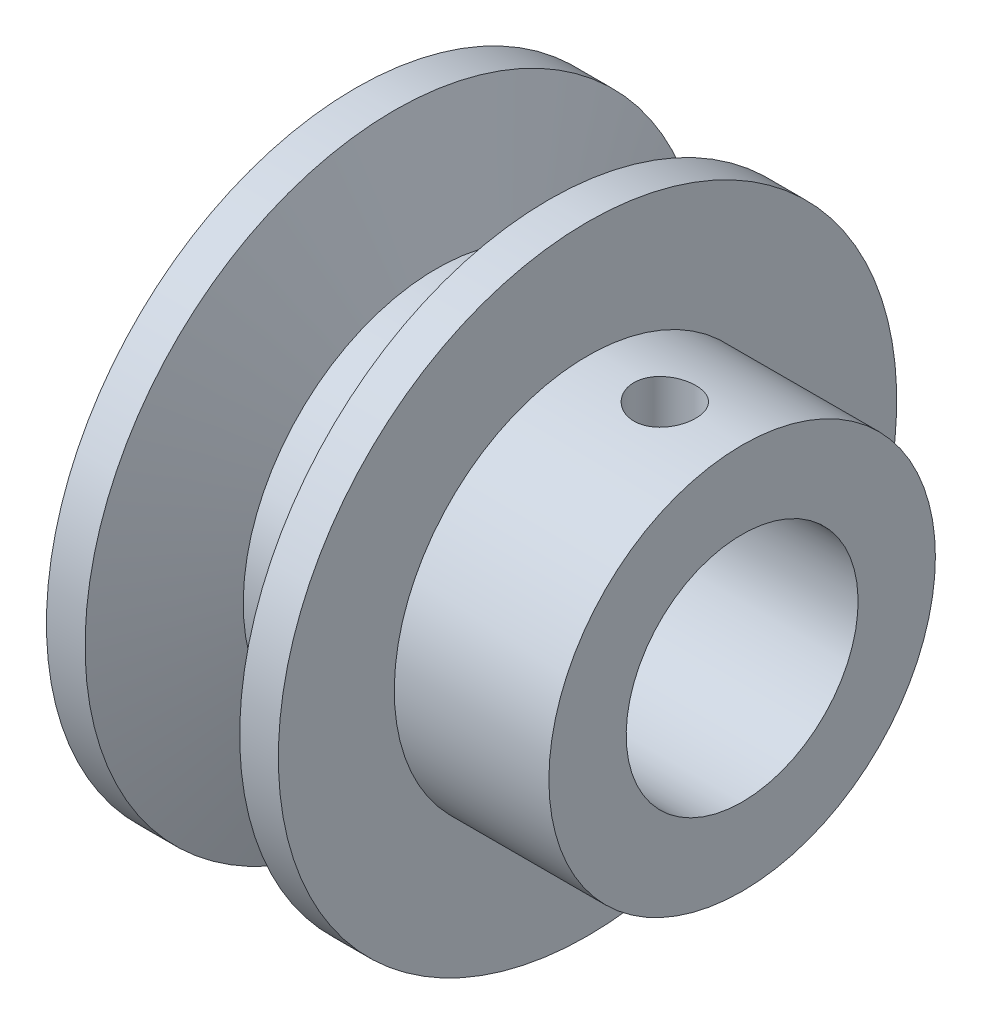
ISO-10303-21;
HEADER;
FILE_DESCRIPTION(('STEP AP214'),'2;1');
FILE_NAME('part.step','',(''),(''),'','','');
FILE_SCHEMA(('AUTOMOTIVE_DESIGN { 1 0 10303 214 1 1 1 1 }'));
ENDSEC;
DATA;
#1=APPLICATION_CONTEXT('core data for automotive mechanical design processes');
#2=APPLICATION_PROTOCOL_DEFINITION('international standard','automotive_design',2000,#1);
#3=PRODUCT_CONTEXT('',#1,'mechanical');
#4=PRODUCT('Part','Part','',(#3));
#5=PRODUCT_RELATED_PRODUCT_CATEGORY('part','',(#4));
#6=PRODUCT_DEFINITION_FORMATION('','',#4);
#7=PRODUCT_DEFINITION_CONTEXT('part definition',#1,'design');
#8=PRODUCT_DEFINITION('design','',#6,#7);
#9=PRODUCT_DEFINITION_SHAPE('','',#8);
#10=(LENGTH_UNIT() NAMED_UNIT(*) SI_UNIT(.MILLI.,.METRE.));
#11=(NAMED_UNIT(*) PLANE_ANGLE_UNIT() SI_UNIT($,.RADIAN.));
#12=(NAMED_UNIT(*) SI_UNIT($,.STERADIAN.) SOLID_ANGLE_UNIT());
#13=UNCERTAINTY_MEASURE_WITH_UNIT(LENGTH_MEASURE(1.E-05),#10,'distance_accuracy_value','');
#14=(GEOMETRIC_REPRESENTATION_CONTEXT(3) GLOBAL_UNCERTAINTY_ASSIGNED_CONTEXT((#13)) GLOBAL_UNIT_ASSIGNED_CONTEXT((#10,
#11,#12)) REPRESENTATION_CONTEXT('',''));
#15=CARTESIAN_POINT('',(0.,0.,0.));
#16=DIRECTION('',(0.,0.,1.));
#17=DIRECTION('',(1.,0.,0.));
#18=AXIS2_PLACEMENT_3D('',#15,#16,#17);
#19=CARTESIAN_POINT('',(0.,0.,0.));
#20=DIRECTION('',(1.,0.,0.));
#21=DIRECTION('',(0.,1.,0.));
#22=AXIS2_PLACEMENT_3D('',#19,#20,#21);
#23=PLANE('',#22);
#24=CARTESIAN_POINT('',(0.,0.,0.));
#25=DIRECTION('',(-1.,0.,0.));
#26=DIRECTION('',(0.,-1.,0.));
#27=AXIS2_PLACEMENT_3D('',#24,#25,#26);
#28=CIRCLE('',#27,20.);
#29=CARTESIAN_POINT('',(0.,-20.,0.));
#30=VERTEX_POINT('',#29);
#31=EDGE_CURVE('E67',#30,#30,#28,.T.);
#32=ORIENTED_EDGE('',*,*,#31,.F.);
#33=EDGE_LOOP('',(#32));
#34=FACE_BOUND('',#33,.T.);
#35=CARTESIAN_POINT('',(0.,0.,0.));
#36=DIRECTION('',(-1.,0.,0.));
#37=DIRECTION('',(0.,-1.,0.));
#38=AXIS2_PLACEMENT_3D('',#35,#36,#37);
#39=CIRCLE('',#38,40.);
#40=CARTESIAN_POINT('',(0.,-40.,0.));
#41=VERTEX_POINT('',#40);
#42=EDGE_CURVE('E42',#41,#41,#39,.T.);
#43=ORIENTED_EDGE('',*,*,#42,.T.);
#44=EDGE_LOOP('',(#43));
#45=FACE_BOUND('',#44,.T.);
#46=ADVANCED_FACE('F36',(#34,#45),#23,.F.);
#47=CARTESIAN_POINT('',(0.,0.,0.));
#48=DIRECTION('',(-1.,0.,0.));
#49=DIRECTION('',(0.,-1.,0.));
#50=AXIS2_PLACEMENT_3D('',#47,#48,#49);
#51=CYLINDRICAL_SURFACE('',#50,40.);
#52=ORIENTED_EDGE('',*,*,#42,.F.);
#53=EDGE_LOOP('',(#52));
#54=FACE_BOUND('',#53,.T.);
#55=CARTESIAN_POINT('',(5.,0.,0.));
#56=DIRECTION('',(-1.,0.,0.));
#57=DIRECTION('',(0.,-1.,0.));
#58=AXIS2_PLACEMENT_3D('',#55,#56,#57);
#59=CIRCLE('',#58,40.);
#60=CARTESIAN_POINT('',(4.99999999999999,-40.,0.));
#61=VERTEX_POINT('',#60);
#62=EDGE_CURVE('E46',#61,#61,#59,.T.);
#63=ORIENTED_EDGE('',*,*,#62,.T.);
#64=EDGE_LOOP('',(#63));
#65=FACE_BOUND('',#64,.T.);
#66=ADVANCED_FACE('F127',(#54,#65),#51,.T.);
#67=CARTESIAN_POINT('',(10.459553513993,0.,0.));
#68=DIRECTION('',(-1.,0.,0.));
#69=DIRECTION('',(0.,-1.,0.));
#70=AXIS2_PLACEMENT_3D('',#67,#68,#69);
#71=CONICAL_SURFACE('',#70,25.,1.22173047639603);
#72=ORIENTED_EDGE('',*,*,#62,.F.);
#73=EDGE_LOOP('',(#72));
#74=FACE_BOUND('',#73,.T.);
#75=CARTESIAN_POINT('',(10.459553513993,0.,0.));
#76=DIRECTION('',(-1.,0.,0.));
#77=DIRECTION('',(0.,-1.,0.));
#78=AXIS2_PLACEMENT_3D('',#75,#76,#77);
#79=CIRCLE('',#78,25.);
#80=CARTESIAN_POINT('',(10.459553513993,-25.,0.));
#81=VERTEX_POINT('',#80);
#82=EDGE_CURVE('E50',#81,#81,#79,.T.);
#83=ORIENTED_EDGE('',*,*,#82,.T.);
#84=EDGE_LOOP('',(#83));
#85=FACE_BOUND('',#84,.T.);
#86=ADVANCED_FACE('F124',(#74,#85),#71,.T.);
#87=CARTESIAN_POINT('',(0.,0.,0.));
#88=DIRECTION('',(-1.,0.,0.));
#89=DIRECTION('',(0.,-1.,0.));
#90=AXIS2_PLACEMENT_3D('',#87,#88,#89);
#91=CYLINDRICAL_SURFACE('',#90,25.);
#92=ORIENTED_EDGE('',*,*,#82,.F.);
#93=EDGE_LOOP('',(#92));
#94=FACE_BOUND('',#93,.T.);
#95=CARTESIAN_POINT('',(19.5404464860069,0.,0.));
#96=DIRECTION('',(-1.,0.,0.));
#97=DIRECTION('',(0.,-1.,0.));
#98=AXIS2_PLACEMENT_3D('',#95,#96,#97);
#99=CIRCLE('',#98,25.);
#100=CARTESIAN_POINT('',(19.5404464860069,-25.,0.));
#101=VERTEX_POINT('',#100);
#102=EDGE_CURVE('E55',#101,#101,#99,.T.);
#103=ORIENTED_EDGE('',*,*,#102,.T.);
#104=EDGE_LOOP('',(#103));
#105=FACE_BOUND('',#104,.T.);
#106=ADVANCED_FACE('F120',(#94,#105),#91,.T.);
#107=CARTESIAN_POINT('',(25.,0.,0.));
#108=DIRECTION('',(1.,0.,0.));
#109=DIRECTION('',(0.,1.,0.));
#110=AXIS2_PLACEMENT_3D('',#107,#108,#109);
#111=CONICAL_SURFACE('',#110,40.,1.22173047639603);
#112=ORIENTED_EDGE('',*,*,#102,.F.);
#113=EDGE_LOOP('',(#112));
#114=FACE_BOUND('',#113,.T.);
#115=CARTESIAN_POINT('',(25.,0.,0.));
#116=DIRECTION('',(-1.,0.,0.));
#117=DIRECTION('',(0.,-1.,0.));
#118=AXIS2_PLACEMENT_3D('',#115,#116,#117);
#119=CIRCLE('',#118,40.);
#120=CARTESIAN_POINT('',(25.,-40.,0.));
#121=VERTEX_POINT('',#120);
#122=EDGE_CURVE('E58',#121,#121,#119,.T.);
#123=ORIENTED_EDGE('',*,*,#122,.T.);
#124=EDGE_LOOP('',(#123));
#125=FACE_BOUND('',#124,.T.);
#126=ADVANCED_FACE('F116',(#114,#125),#111,.T.);
#127=CARTESIAN_POINT('',(0.,0.,0.));
#128=DIRECTION('',(-1.,0.,0.));
#129=DIRECTION('',(0.,-1.,0.));
#130=AXIS2_PLACEMENT_3D('',#127,#128,#129);
#131=CYLINDRICAL_SURFACE('',#130,40.);
#132=ORIENTED_EDGE('',*,*,#122,.F.);
#133=EDGE_LOOP('',(#132));
#134=FACE_BOUND('',#133,.T.);
#135=CARTESIAN_POINT('',(30.,0.,0.));
#136=DIRECTION('',(-1.,0.,0.));
#137=DIRECTION('',(0.,-1.,0.));
#138=AXIS2_PLACEMENT_3D('',#135,#136,#137);
#139=CIRCLE('',#138,40.);
#140=CARTESIAN_POINT('',(30.,-40.,0.));
#141=VERTEX_POINT('',#140);
#142=EDGE_CURVE('E61',#141,#141,#139,.T.);
#143=ORIENTED_EDGE('',*,*,#142,.T.);
#144=EDGE_LOOP('',(#143));
#145=FACE_BOUND('',#144,.T.);
#146=ADVANCED_FACE('F112',(#134,#145),#131,.T.);
#147=CARTESIAN_POINT('',(30.,40.,0.));
#148=DIRECTION('',(-1.,0.,0.));
#149=DIRECTION('',(0.,-1.,0.));
#150=AXIS2_PLACEMENT_3D('',#147,#148,#149);
#151=PLANE('',#150);
#152=CARTESIAN_POINT('',(30.,0.,0.));
#153=DIRECTION('',(-1.,0.,0.));
#154=DIRECTION('',(0.,-1.,0.));
#155=AXIS2_PLACEMENT_3D('',#152,#153,#154);
#156=CIRCLE('',#155,25.);
#157=CARTESIAN_POINT('',(30.,-25.,0.));
#158=VERTEX_POINT('',#157);
#159=EDGE_CURVE('E10',#158,#158,#156,.F.);
#160=ORIENTED_EDGE('',*,*,#159,.F.);
#161=EDGE_LOOP('',(#160));
#162=FACE_BOUND('',#161,.T.);
#163=ORIENTED_EDGE('',*,*,#142,.F.);
#164=EDGE_LOOP('',(#163));
#165=FACE_BOUND('',#164,.T.);
#166=ADVANCED_FACE('F108',(#162,#165),#151,.F.);
#167=CARTESIAN_POINT('',(50.,0.,0.));
#168=DIRECTION('',(-1.,0.,0.));
#169=DIRECTION('',(0.,-1.,0.));
#170=AXIS2_PLACEMENT_3D('',#167,#168,#169);
#171=CYLINDRICAL_SURFACE('',#170,25.);
#172=CARTESIAN_POINT('',(40.,24.6779253585061,4.00000000000001));
#173=CARTESIAN_POINT('',(40.2231334307392,24.6779292731494,3.99999092536539));
#174=CARTESIAN_POINT('',(40.4463918817528,24.6809844341802,3.98126611040704));
#175=CARTESIAN_POINT('',(40.8866536946893,24.6928650235043,3.9068889100177));
#176=CARTESIAN_POINT('',(41.1036509490092,24.7016958995272,3.85120166039988));
#177=CARTESIAN_POINT('',(41.5249546262025,24.7241027007214,3.70461945874254));
#178=CARTESIAN_POINT('',(41.7292711432905,24.7376747931883,3.6137529385178));
#179=CARTESIAN_POINT('',(42.1197329607769,24.7680302580012,3.39946083296861));
#180=CARTESIAN_POINT('',(42.3058804898718,24.784813235735,3.27603924790085));
#181=CARTESIAN_POINT('',(42.6564378655906,24.819870017184,2.99894280472959));
#182=CARTESIAN_POINT('',(42.8206585310196,24.8381548393908,2.84502997415169));
#183=CARTESIAN_POINT('',(43.1210589193203,24.8740570032156,2.51183419630463));
#184=CARTESIAN_POINT('',(43.2572370306015,24.8916743064242,2.33254979194337));
#185=CARTESIAN_POINT('',(43.4983919225834,24.9243725216135,1.95247983405863));
#186=CARTESIAN_POINT('',(43.6031933806762,24.9394389842577,1.75158168894769));
#187=CARTESIAN_POINT('',(43.77749387812,24.9652155524521,1.33475199178192));
#188=CARTESIAN_POINT('',(43.8469950349814,24.9759259192977,1.11882134234493));
#189=CARTESIAN_POINT('',(43.9481454887249,24.9917057633414,0.680008257892135));
#190=CARTESIAN_POINT('',(43.9801122388102,24.9968225235199,0.457200726718813));
#191=CARTESIAN_POINT('',(44.0062730161714,25.001000923532,0.00932961504450166));
#192=CARTESIAN_POINT('',(44.0004694182899,25.0000629440624,-0.215733822726023));
#193=CARTESIAN_POINT('',(43.95150302863,24.9922751229404,-0.659559431957065));
#194=CARTESIAN_POINT('',(43.9086818315054,24.9854793381704,-0.878360374642832));
#195=CARTESIAN_POINT('',(43.7874329707507,24.9667997195147,-1.30563068549535));
#196=CARTESIAN_POINT('',(43.7090042903812,24.9549157403409,-1.51409975845637));
#197=CARTESIAN_POINT('',(43.5184230825998,24.9273026006901,-1.91581197281808));
#198=CARTESIAN_POINT('',(43.4061285452084,24.9115573014927,-2.10898658698768));
#199=CARTESIAN_POINT('',(43.151107142766,24.8779731229889,-2.47387934314066));
#200=CARTESIAN_POINT('',(43.0083780036584,24.8601340872846,-2.64559588026693));
#201=CARTESIAN_POINT('',(42.6946408728795,24.8241131404317,-2.96471443147072));
#202=CARTESIAN_POINT('',(42.5233344483182,24.8059296259375,-3.111823016432));
#203=CARTESIAN_POINT('',(42.1583144874561,24.7714627701456,-3.37525361654882));
#204=CARTESIAN_POINT('',(41.9646007746212,24.7551794438203,-3.49157538912893));
#205=CARTESIAN_POINT('',(41.559938980086,24.7263563099702,-3.69018063254586));
#206=CARTESIAN_POINT('',(41.3489743296873,24.7138201565097,-3.77243090843838));
#207=CARTESIAN_POINT('',(40.9159787567133,24.6939728783789,-3.9002470802389));
#208=CARTESIAN_POINT('',(40.6939487292713,24.6866613317959,-3.94581593839022));
#209=CARTESIAN_POINT('',(40.2477443546531,24.6781720983454,-3.99856699995258));
#210=CARTESIAN_POINT('',(40.0236205706312,24.676927730288,-4.00616652749842));
#211=CARTESIAN_POINT('',(39.5773020674687,24.6805363746112,-3.98387335096491));
#212=CARTESIAN_POINT('',(39.355107280175,24.6853891706843,-3.95398197694093));
#213=CARTESIAN_POINT('',(38.9202661891112,24.7005838939959,-3.85791055409722));
#214=CARTESIAN_POINT('',(38.7075721536385,24.7108939600193,-3.79194106688482));
#215=CARTESIAN_POINT('',(38.2962592259666,24.7358149947642,-3.62580613822712));
#216=CARTESIAN_POINT('',(38.0976411166363,24.7504262024721,-3.5256387965801));
#217=CARTESIAN_POINT('',(37.7182552138371,24.7824590360601,-3.29295930434825));
#218=CARTESIAN_POINT('',(37.5376540928599,24.7999035665773,-3.16017860187711));
#219=CARTESIAN_POINT('',(37.2011478787265,24.8355696830306,-2.8664120849539));
#220=CARTESIAN_POINT('',(37.0452443827199,24.8537913191241,-2.70542444782833));
#221=CARTESIAN_POINT('',(36.7610454158143,24.8891684164148,-2.35796950976243));
#222=CARTESIAN_POINT('',(36.6330275417784,24.9063120466622,-2.17127376458599));
#223=CARTESIAN_POINT('',(36.410173908023,24.9374141993437,-1.77878369477712));
#224=CARTESIAN_POINT('',(36.3153371413544,24.951372818429,-1.57298994995265));
#225=CARTESIAN_POINT('',(36.1619745519626,24.9744805999486,-1.14898755418868));
#226=CARTESIAN_POINT('',(36.103300787528,24.9836493338541,-0.930833526197157));
#227=CARTESIAN_POINT('',(36.023452327215,24.9962267816708,-0.487610510439652));
#228=CARTESIAN_POINT('',(36.0022747976919,24.9996359308412,-0.262542046515459));
#229=CARTESIAN_POINT('',(35.9980964038414,25.0003046769524,0.185436321491428));
#230=CARTESIAN_POINT('',(36.0146722011942,24.9976324661082,0.408342289565956));
#231=CARTESIAN_POINT('',(36.0846176765437,24.9865772449389,0.848152662274451));
#232=CARTESIAN_POINT('',(36.1379871867012,24.9781942606641,1.06505709428052));
#233=CARTESIAN_POINT('',(36.2798476496557,24.9566555788897,1.48656424622589));
#234=CARTESIAN_POINT('',(36.3683053440961,24.943504401936,1.69117840464935));
#235=CARTESIAN_POINT('',(36.5777849207578,24.9138685991873,2.082726396611));
#236=CARTESIAN_POINT('',(36.6988081489244,24.8973838356209,2.26965949895309));
#237=CARTESIAN_POINT('',(36.9714966407688,24.8626909278472,2.62267778293662));
#238=CARTESIAN_POINT('',(37.123473005973,24.8444663732144,2.78852106637673));
#239=CARTESIAN_POINT('',(37.4530997377273,24.8084646906746,3.09250238165525));
#240=CARTESIAN_POINT('',(37.6307561114424,24.7906876686017,3.23063391295197));
#241=CARTESIAN_POINT('',(38.008058347838,24.7574701004892,3.47608383472304));
#242=CARTESIAN_POINT('',(38.2078389005129,24.7420453966957,3.58319732214779));
#243=CARTESIAN_POINT('',(38.6227165793267,24.7154654409001,3.76218364779547));
#244=CARTESIAN_POINT('',(38.8377979030824,24.7043058577525,3.83409225684191));
#245=CARTESIAN_POINT('',(39.2114759162413,24.6900374012308,3.92471971325528));
#246=CARTESIAN_POINT('',(39.367790586943,24.6855201523276,3.95290540227376));
#247=CARTESIAN_POINT('',(39.6827157891212,24.679462762736,3.99054862340905));
#248=CARTESIAN_POINT('',(39.8413262840762,24.6779225747413,4.00000645311638));
#249=CARTESIAN_POINT('',(40.,24.6779253585061,4.00000000000001));
#250=B_SPLINE_CURVE_WITH_KNOTS('',3,(#172,#173,#174,#175,#176,#177,#178,#179,#180,#181,#182,
#183,#184,#185,#186,#187,#188,#189,#190,#191,#192,#193,#194,#195,#196,#197,#198,#199,#200,#201,
#202,#203,#204,#205,#206,#207,#208,#209,#210,#211,#212,#213,#214,#215,#216,#217,#218,#219,#220,
#221,#222,#223,#224,#225,#226,#227,#228,#229,#230,#231,#232,#233,#234,#235,#236,#237,#238,#239,
#240,#241,#242,#243,#244,#245,#246,#247,#248,#249),.UNSPECIFIED.,.T.,.F.,(4,2,2,2,2,2,2,2,2,2,2,
2,2,2,2,2,2,2,2,2,2,2,2,2,2,2,2,2,2,2,2,2,2,2,2,2,2,2,4),(0.,0.668820164924194,1.33827208126566,
2.00718407360898,2.67601391055898,3.3502853867162,4.02459560208043,4.702606190066,
5.38057610236087,6.0527697022573,6.72492103782048,7.39093524697726,8.05696847476321,
8.72583436356143,9.39475024717233,10.0711476867558,10.7475504556511,11.4246106844065,
12.1016162310225,12.7711641266712,13.4406882696084,14.10634595422,14.7720406320821,
15.4434123585964,16.1148274837666,16.7926485080713,17.4704489607171,18.1454578213466,
18.8204156684048,19.4878423409542,20.1552659689695,20.8220584849997,21.4888785640389,
22.1627644212778,22.8368081723264,23.5152080182645,24.1929171205326,24.6685332883235,
25.1441418983902),.UNSPECIFIED.);
#251=CARTESIAN_POINT('',(40.,24.6779253585061,4.00000000000001));
#252=VERTEX_POINT('',#251);
#253=EDGE_CURVE('E74',#252,#252,#250,.T.);
#254=ORIENTED_EDGE('',*,*,#253,.F.);
#255=EDGE_LOOP('',(#254));
#256=FACE_BOUND('',#255,.T.);
#257=CARTESIAN_POINT('',(50.,0.,0.));
#258=DIRECTION('',(1.,0.,0.));
#259=DIRECTION('',(0.,1.,0.));
#260=AXIS2_PLACEMENT_3D('',#257,#258,#259);
#261=CIRCLE('',#260,25.);
#262=CARTESIAN_POINT('',(50.,25.,0.));
#263=VERTEX_POINT('',#262);
#264=EDGE_CURVE('E64',#263,#263,#261,.T.);
#265=ORIENTED_EDGE('',*,*,#264,.F.);
#266=EDGE_LOOP('',(#265));
#267=FACE_BOUND('',#266,.T.);
#268=ORIENTED_EDGE('',*,*,#159,.T.);
#269=EDGE_LOOP('',(#268));
#270=FACE_BOUND('',#269,.T.);
#271=ADVANCED_FACE('F104',(#256,#267,#270),#171,.T.);
#272=CARTESIAN_POINT('',(50.,0.,0.));
#273=DIRECTION('',(1.,0.,0.));
#274=DIRECTION('',(0.,1.,0.));
#275=AXIS2_PLACEMENT_3D('',#272,#273,#274);
#276=PLANE('',#275);
#277=CARTESIAN_POINT('',(50.,0.,0.));
#278=DIRECTION('',(-1.,0.,0.));
#279=DIRECTION('',(0.,-1.,0.));
#280=AXIS2_PLACEMENT_3D('',#277,#278,#279);
#281=CIRCLE('',#280,15.);
#282=CARTESIAN_POINT('',(50.,-15.,0.));
#283=VERTEX_POINT('',#282);
#284=EDGE_CURVE('E70',#283,#283,#281,.T.);
#285=ORIENTED_EDGE('',*,*,#284,.T.);
#286=EDGE_LOOP('',(#285));
#287=FACE_BOUND('',#286,.T.);
#288=ORIENTED_EDGE('',*,*,#264,.T.);
#289=EDGE_LOOP('',(#288));
#290=FACE_BOUND('',#289,.T.);
#291=ADVANCED_FACE('F100',(#287,#290),#276,.T.);
#292=CARTESIAN_POINT('',(0.,0.,0.));
#293=DIRECTION('',(-1.,0.,0.));
#294=DIRECTION('',(0.,-1.,0.));
#295=AXIS2_PLACEMENT_3D('',#292,#293,#294);
#296=CONICAL_SURFACE('',#295,20.,0.78539816339745);
#297=CARTESIAN_POINT('',(5.,0.,0.));
#298=DIRECTION('',(-1.,0.,0.));
#299=DIRECTION('',(0.,-1.,0.));
#300=AXIS2_PLACEMENT_3D('',#297,#298,#299);
#301=CIRCLE('',#300,15.);
#302=CARTESIAN_POINT('',(5.,-15.,0.));
#303=VERTEX_POINT('',#302);
#304=EDGE_CURVE('E71',#303,#303,#301,.T.);
#305=ORIENTED_EDGE('',*,*,#304,.F.);
#306=EDGE_LOOP('',(#305));
#307=FACE_BOUND('',#306,.T.);
#308=ORIENTED_EDGE('',*,*,#31,.T.);
#309=EDGE_LOOP('',(#308));
#310=FACE_BOUND('',#309,.T.);
#311=ADVANCED_FACE('F96',(#307,#310),#296,.F.);
#312=CARTESIAN_POINT('',(50.,0.,0.));
#313=DIRECTION('',(-1.,0.,0.));
#314=DIRECTION('',(0.,-1.,0.));
#315=AXIS2_PLACEMENT_3D('',#312,#313,#314);
#316=CYLINDRICAL_SURFACE('',#315,15.);
#317=CARTESIAN_POINT('',(40.,14.4568322948009,4.00000000000001));
#318=CARTESIAN_POINT('',(39.7796481245194,14.456836113945,3.99999468631743));
#319=CARTESIAN_POINT('',(39.559239999048,14.4619252909934,3.98172986449486));
#320=CARTESIAN_POINT('',(39.1247891568872,14.4816712231019,3.90929166520475));
#321=CARTESIAN_POINT('',(38.9107496900439,14.4963327781587,3.85510027241906));
#322=CARTESIAN_POINT('',(38.4953838601064,14.5334475035368,3.71271691120147));
#323=CARTESIAN_POINT('',(38.2940400823431,14.5558897136841,3.62457275084356));
#324=CARTESIAN_POINT('',(37.9089665198803,14.606023098408,3.41693569127407));
#325=CARTESIAN_POINT('',(37.725238104986,14.6337146806885,3.297440356829));
#326=CARTESIAN_POINT('',(37.3760149060246,14.6920027910693,3.0272969574912));
#327=CARTESIAN_POINT('',(37.2110259650711,14.7226508223288,2.87600595008417));
#328=CARTESIAN_POINT('',(36.9084368460976,14.7829540287301,2.54794854568042));
#329=CARTESIAN_POINT('',(36.7708395077164,14.8126091006688,2.37117951069329));
#330=CARTESIAN_POINT('',(36.5248301231941,14.8681597693683,1.99367634174654));
#331=CARTESIAN_POINT('',(36.4169209627343,14.8939875252458,1.79260363975896));
#332=CARTESIAN_POINT('',(36.2366307292655,14.9383825242367,1.37436608945818));
#333=CARTESIAN_POINT('',(36.1642436654369,14.9569509915252,1.1572039617502));
#334=CARTESIAN_POINT('',(36.0586895595284,14.9843710715292,0.718231923620177));
#335=CARTESIAN_POINT('',(36.0246620467481,14.9934355350052,0.496642448401829));
#336=CARTESIAN_POINT('',(35.9940857597856,15.001570492355,0.0507271070171439));
#337=CARTESIAN_POINT('',(35.9975307127397,15.0006426589323,-0.173598294877071));
#338=CARTESIAN_POINT('',(36.0411956250789,14.9890535171952,-0.612628474222695));
#339=CARTESIAN_POINT('',(36.0804859152725,14.9786382805395,-0.827433201442208));
#340=CARTESIAN_POINT('',(36.1932242755639,14.9495349718099,-1.24728263114214));
#341=CARTESIAN_POINT('',(36.2666742933722,14.9308464280136,-1.45232677636124));
#342=CARTESIAN_POINT('',(36.4463596951846,14.886931381996,-1.84920789029504));
#343=CARTESIAN_POINT('',(36.5529136142008,14.8616417575466,-2.04089337265881));
#344=CARTESIAN_POINT('',(36.7955376390187,14.8072493701968,-2.40397999752931));
#345=CARTESIAN_POINT('',(36.9316134980584,14.7781458644853,-2.57537717617275));
#346=CARTESIAN_POINT('',(37.2343537158657,14.7182254587482,-2.89857073893017));
#347=CARTESIAN_POINT('',(37.4018288900907,14.6873833872759,-3.04960384035149));
#348=CARTESIAN_POINT('',(37.7600493524856,14.6282681005693,-3.32162664209939));
#349=CARTESIAN_POINT('',(37.9507960584307,14.5999950420307,-3.44261451061105));
#350=CARTESIAN_POINT('',(38.3518002036193,14.549118045243,-3.65169358371401));
#351=CARTESIAN_POINT('',(38.5621707017281,14.5265501404503,-3.73957733196032));
#352=CARTESIAN_POINT('',(38.9954529988077,14.4900865003604,-3.87848003366227));
#353=CARTESIAN_POINT('',(39.2183616728695,14.4761886145698,-3.92950812921312));
#354=CARTESIAN_POINT('',(39.6632544220785,14.4590967126159,-3.99193514186923));
#355=CARTESIAN_POINT('',(39.8850670972485,14.4555952643646,-4.00447265242679));
#356=CARTESIAN_POINT('',(40.3276195456113,14.4588515677208,-3.99269962245617));
#357=CARTESIAN_POINT('',(40.5483594304784,14.4656082275034,-3.9683930034456));
#358=CARTESIAN_POINT('',(40.9781131881846,14.4883224864021,-3.88462543740026));
#359=CARTESIAN_POINT('',(41.1872708758749,14.5041007939926,-3.82584895825867));
#360=CARTESIAN_POINT('',(41.5927592627195,14.542905379049,-3.67557973450926));
#361=CARTESIAN_POINT('',(41.7890882828547,14.5659326029694,-3.58408271753296));
#362=CARTESIAN_POINT('',(42.1681099148705,14.6172714494615,-3.3686581101742));
#363=CARTESIAN_POINT('',(42.3504079517795,14.6456880974578,-3.2440619047585));
#364=CARTESIAN_POINT('',(42.6919266034063,14.7043568386728,-2.96680455975028));
#365=CARTESIAN_POINT('',(42.8511428699083,14.7346092762046,-2.81413814445933));
#366=CARTESIAN_POINT('',(43.1467049464998,14.7945992976892,-2.47980756500969));
#367=CARTESIAN_POINT('',(43.2822567539572,14.824296730477,-2.2974328320177));
#368=CARTESIAN_POINT('',(43.520821974821,14.8789334003425,-1.91185687188149));
#369=CARTESIAN_POINT('',(43.6238371201578,14.9038728906581,-1.70865675403777));
#370=CARTESIAN_POINT('',(43.793459264723,14.9460230179852,-1.28862826965175));
#371=CARTESIAN_POINT('',(43.8603380388869,14.9632911696077,-1.07191570576467));
#372=CARTESIAN_POINT('',(43.9565774561287,14.9884060757449,-0.629798769462638));
#373=CARTESIAN_POINT('',(43.9859464135494,14.9962549180996,-0.404396334640485));
#374=CARTESIAN_POINT('',(44.0058116474829,15.0015482687538,0.0412840026923005));
#375=CARTESIAN_POINT('',(43.9974726382623,14.9993045257616,0.261507023055731));
#376=CARTESIAN_POINT('',(43.9448630128496,14.9853698195772,0.697296609261439));
#377=CARTESIAN_POINT('',(43.9005937457659,14.9736792110957,0.912863349625632));
#378=CARTESIAN_POINT('',(43.7780387901628,14.9422262078184,1.33182024692842));
#379=CARTESIAN_POINT('',(43.6999894130551,14.9225199437846,1.53528402370308));
#380=CARTESIAN_POINT('',(43.5123007965075,14.8770963303299,1.92634419694271));
#381=CARTESIAN_POINT('',(43.4026571267744,14.851378137985,2.1139383633243));
#382=CARTESIAN_POINT('',(43.1514834557259,14.7958266244824,2.47335653734735));
#383=CARTESIAN_POINT('',(43.0091812386027,14.7659018674327,2.64462672346663));
#384=CARTESIAN_POINT('',(42.6981945012702,14.7056800015451,2.96125074312267));
#385=CARTESIAN_POINT('',(42.5295030483613,14.6753827967944,3.10659774486097));
#386=CARTESIAN_POINT('',(42.1660632083648,14.6170791927771,3.37041400465124));
#387=CARTESIAN_POINT('',(41.9708233726856,14.5891378244929,3.48822188522467));
#388=CARTESIAN_POINT('',(41.5625873782795,14.5396278780694,3.68917378060109));
#389=CARTESIAN_POINT('',(41.349602942921,14.5180551344989,3.77234046734664));
#390=CARTESIAN_POINT('',(40.9478373278975,14.4867200130775,3.89076248504962));
#391=CARTESIAN_POINT('',(40.7607974708866,14.4756028054439,3.93163036798979));
#392=CARTESIAN_POINT('',(40.3825188840121,14.4606577042314,3.9862498858776));
#393=CARTESIAN_POINT('',(40.1912806354224,14.4568289795203,4.00000461264321));
#394=CARTESIAN_POINT('',(40.,14.4568322948009,4.00000000000001));
#395=B_SPLINE_CURVE_WITH_KNOTS('',3,(#317,#318,#319,#320,#321,#322,#323,#324,#325,#326,#327,
#328,#329,#330,#331,#332,#333,#334,#335,#336,#337,#338,#339,#340,#341,#342,#343,#344,#345,#346,
#347,#348,#349,#350,#351,#352,#353,#354,#355,#356,#357,#358,#359,#360,#361,#362,#363,#364,#365,
#366,#367,#368,#369,#370,#371,#372,#373,#374,#375,#376,#377,#378,#379,#380,#381,#382,#383,#384,
#385,#386,#387,#388,#389,#390,#391,#392,#393,#394),.UNSPECIFIED.,.T.,.F.,(4,2,2,2,2,2,2,2,2,2,2,
2,2,2,2,2,2,2,2,2,2,2,2,2,2,2,2,2,2,2,2,2,2,2,2,2,2,2,4),(0.,0.660352256232053,1.32103589570041,
1.98079262319234,2.64060061312209,3.31531832260422,3.99010594248923,4.67570414741607,
5.36118668608493,6.03096608632962,6.70063336771207,7.35341141601609,8.00622668881393,
8.66552897811142,9.32495986788984,10.0046352460066,10.6843520527916,11.3682603019536,
12.0519988484194,12.7153066848897,13.3785439269193,14.0290370087007,14.6796150573457,
15.3444926994047,16.0094954308787,16.6937181392419,17.3779044202113,18.0568707918772,
18.7356866392293,19.3936810983785,20.0516508523085,20.7050902974225,21.3586214153685,
22.0295770798808,22.7007093076702,23.3866007797608,24.0720426420754,24.6453393534799,
25.2185706858622),.UNSPECIFIED.);
#396=CARTESIAN_POINT('',(40.,14.4568322948009,4.00000000000001));
#397=VERTEX_POINT('',#396);
#398=EDGE_CURVE('E84',#397,#397,#395,.T.);
#399=ORIENTED_EDGE('',*,*,#398,.F.);
#400=EDGE_LOOP('',(#399));
#401=FACE_BOUND('',#400,.T.);
#402=ORIENTED_EDGE('',*,*,#284,.F.);
#403=EDGE_LOOP('',(#402));
#404=FACE_BOUND('',#403,.T.);
#405=ORIENTED_EDGE('',*,*,#304,.T.);
#406=EDGE_LOOP('',(#405));
#407=FACE_BOUND('',#406,.T.);
#408=ADVANCED_FACE('F93',(#401,#404,#407),#316,.F.);
#409=CARTESIAN_POINT('',(40.,-40.001,0.));
#410=DIRECTION('',(0.,1.,0.));
#411=DIRECTION('',(0.,0.,1.));
#412=AXIS2_PLACEMENT_3D('',#409,#410,#411);
#413=CYLINDRICAL_SURFACE('',#412,4.00000000000001);
#414=ORIENTED_EDGE('',*,*,#398,.T.);
#415=EDGE_LOOP('',(#414));
#416=FACE_BOUND('',#415,.T.);
#417=ORIENTED_EDGE('',*,*,#253,.T.);
#418=EDGE_LOOP('',(#417));
#419=FACE_BOUND('',#418,.T.);
#420=ADVANCED_FACE('F89',(#416,#419),#413,.F.);
#421=CLOSED_SHELL('',(#46,#66,#86,#106,#126,#146,#166,#271,#291,#311,#408,#420));
#422=MANIFOLD_SOLID_BREP('B2',#421);
#423=ADVANCED_BREP_SHAPE_REPRESENTATION('',(#18,#422),#14);
#424=SHAPE_DEFINITION_REPRESENTATION(#9,#423);
ENDSEC;
END-ISO-10303-21;
